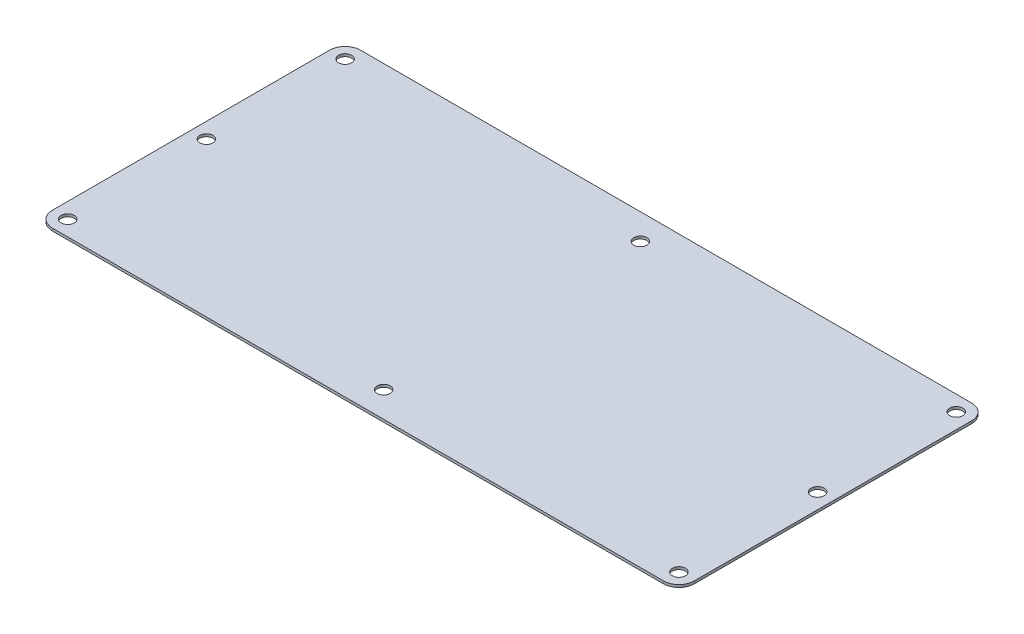
ISO-10303-21;
HEADER;
FILE_DESCRIPTION(('STEP AP214'),'2;1');
FILE_NAME('part.step','',(''),(''),'','','');
FILE_SCHEMA(('AUTOMOTIVE_DESIGN { 1 0 10303 214 1 1 1 1 }'));
ENDSEC;
DATA;
#1=APPLICATION_CONTEXT('core data for automotive mechanical design processes');
#2=APPLICATION_PROTOCOL_DEFINITION('international standard','automotive_design',2000,#1);
#3=PRODUCT_CONTEXT('',#1,'mechanical');
#4=PRODUCT('Part','Part','',(#3));
#5=PRODUCT_RELATED_PRODUCT_CATEGORY('part','',(#4));
#6=PRODUCT_DEFINITION_FORMATION('','',#4);
#7=PRODUCT_DEFINITION_CONTEXT('part definition',#1,'design');
#8=PRODUCT_DEFINITION('design','',#6,#7);
#9=PRODUCT_DEFINITION_SHAPE('','',#8);
#10=(LENGTH_UNIT() NAMED_UNIT(*) SI_UNIT(.MILLI.,.METRE.));
#11=(NAMED_UNIT(*) PLANE_ANGLE_UNIT() SI_UNIT($,.RADIAN.));
#12=(NAMED_UNIT(*) SI_UNIT($,.STERADIAN.) SOLID_ANGLE_UNIT());
#13=UNCERTAINTY_MEASURE_WITH_UNIT(LENGTH_MEASURE(1.E-05),#10,'distance_accuracy_value','');
#14=(GEOMETRIC_REPRESENTATION_CONTEXT(3) GLOBAL_UNCERTAINTY_ASSIGNED_CONTEXT((#13)) GLOBAL_UNIT_ASSIGNED_CONTEXT((#10,
#11,#12)) REPRESENTATION_CONTEXT('',''));
#15=CARTESIAN_POINT('',(0.,0.,0.));
#16=DIRECTION('',(0.,0.,1.));
#17=DIRECTION('',(1.,0.,0.));
#18=AXIS2_PLACEMENT_3D('',#15,#16,#17);
#19=CARTESIAN_POINT('',(30.3435709155538,1.,-127.137110586409));
#20=DIRECTION('',(0.,1.,0.));
#21=DIRECTION('',(0.,0.,1.));
#22=AXIS2_PLACEMENT_3D('',#19,#20,#21);
#23=PLANE('',#22);
#24=CARTESIAN_POINT('',(268.343570915553,1.,-73.1371105864091));
#25=DIRECTION('',(0.,1.,0.));
#26=DIRECTION('',(0.,0.,1.));
#27=AXIS2_PLACEMENT_3D('',#24,#25,#26);
#28=CIRCLE('',#27,2.55);
#29=CARTESIAN_POINT('',(268.343570915553,1.,-70.5871105864091));
#30=VERTEX_POINT('',#29);
#31=EDGE_CURVE('E213',#30,#30,#28,.T.);
#32=ORIENTED_EDGE('',*,*,#31,.F.);
#33=EDGE_LOOP('',(#32));
#34=FACE_BOUND('',#33,.T.);
#35=CARTESIAN_POINT('',(268.343570915554,1.,-19.1371105864091));
#36=DIRECTION('',(0.,1.,0.));
#37=DIRECTION('',(0.,0.,1.));
#38=AXIS2_PLACEMENT_3D('',#35,#36,#37);
#39=CIRCLE('',#38,2.54999999999955);
#40=CARTESIAN_POINT('',(268.343570915554,1.,-16.5871105864096));
#41=VERTEX_POINT('',#40);
#42=EDGE_CURVE('E201',#41,#41,#39,.T.);
#43=ORIENTED_EDGE('',*,*,#42,.F.);
#44=EDGE_LOOP('',(#43));
#45=FACE_BOUND('',#44,.T.);
#46=CARTESIAN_POINT('',(149.343570915554,1.,-123.137110586409));
#47=DIRECTION('',(0.,1.,0.));
#48=DIRECTION('',(0.,0.,1.));
#49=AXIS2_PLACEMENT_3D('',#46,#47,#48);
#50=CIRCLE('',#49,2.55);
#51=CARTESIAN_POINT('',(149.343570915554,1.,-120.587110586409));
#52=VERTEX_POINT('',#51);
#53=EDGE_CURVE('E189',#52,#52,#50,.T.);
#54=ORIENTED_EDGE('',*,*,#53,.F.);
#55=EDGE_LOOP('',(#54));
#56=FACE_BOUND('',#55,.T.);
#57=CARTESIAN_POINT('',(30.3435709155538,1.,-127.137110586409));
#58=DIRECTION('',(0.,1.,0.));
#59=DIRECTION('',(0.,0.,1.));
#60=AXIS2_PLACEMENT_3D('',#57,#58,#59);
#61=CIRCLE('',#60,2.55000000000045);
#62=CARTESIAN_POINT('',(30.3435709155538,1.,-124.587110586409));
#63=VERTEX_POINT('',#62);
#64=EDGE_CURVE('E135',#63,#63,#61,.T.);
#65=ORIENTED_EDGE('',*,*,#64,.F.);
#66=EDGE_LOOP('',(#65));
#67=FACE_BOUND('',#66,.T.);
#68=CARTESIAN_POINT('',(30.3435709155538,1.,-127.137110586409));
#69=DIRECTION('',(0.,1.,0.));
#70=DIRECTION('',(0.,0.,1.));
#71=AXIS2_PLACEMENT_3D('',#68,#69,#70);
#72=CIRCLE('',#71,6.);
#73=CARTESIAN_POINT('',(30.3435709155538,1.,-133.137110586409));
#74=VERTEX_POINT('',#73);
#75=CARTESIAN_POINT('',(24.3435709155538,1.,-127.137110586409));
#76=VERTEX_POINT('',#75);
#77=EDGE_CURVE('E146',#74,#76,#72,.T.);
#78=ORIENTED_EDGE('',*,*,#77,.T.);
#79=DIRECTION('',(0.,0.,1.));
#80=VECTOR('',#79,1.);
#81=CARTESIAN_POINT('',(24.3435709155538,1.,-19.1371105864091));
#82=LINE('',#81,#80);
#83=CARTESIAN_POINT('',(24.3435709155538,1.,-19.1371105864091));
#84=VERTEX_POINT('',#83);
#85=EDGE_CURVE('E94',#76,#84,#82,.T.);
#86=ORIENTED_EDGE('',*,*,#85,.T.);
#87=CARTESIAN_POINT('',(30.3435709155538,1.,-19.1371105864091));
#88=DIRECTION('',(0.,1.,0.));
#89=DIRECTION('',(0.,0.,1.));
#90=AXIS2_PLACEMENT_3D('',#87,#88,#89);
#91=CIRCLE('',#90,6.);
#92=CARTESIAN_POINT('',(30.3435709155538,1.,-13.1371105864091));
#93=VERTEX_POINT('',#92);
#94=EDGE_CURVE('E161',#84,#93,#91,.T.);
#95=ORIENTED_EDGE('',*,*,#94,.T.);
#96=DIRECTION('',(1.,0.,0.));
#97=VECTOR('',#96,1.);
#98=CARTESIAN_POINT('',(268.343570915554,1.,-13.1371105864091));
#99=LINE('',#98,#97);
#100=CARTESIAN_POINT('',(268.343570915554,1.,-13.1371105864091));
#101=VERTEX_POINT('',#100);
#102=EDGE_CURVE('E174',#93,#101,#99,.T.);
#103=ORIENTED_EDGE('',*,*,#102,.T.);
#104=CARTESIAN_POINT('',(268.343570915554,1.,-19.1371105864091));
#105=DIRECTION('',(0.,1.,0.));
#106=DIRECTION('',(0.,0.,1.));
#107=AXIS2_PLACEMENT_3D('',#104,#105,#106);
#108=CIRCLE('',#107,6.);
#109=CARTESIAN_POINT('',(274.343570915554,1.,-19.1371105864091));
#110=VERTEX_POINT('',#109);
#111=EDGE_CURVE('E113',#101,#110,#108,.T.);
#112=ORIENTED_EDGE('',*,*,#111,.T.);
#113=DIRECTION('',(0.,0.,-1.));
#114=VECTOR('',#113,1.);
#115=CARTESIAN_POINT('',(274.343570915554,1.,-127.137110586409));
#116=LINE('',#115,#114);
#117=CARTESIAN_POINT('',(274.343570915554,1.,-127.137110586409));
#118=VERTEX_POINT('',#117);
#119=EDGE_CURVE('E107',#110,#118,#116,.T.);
#120=ORIENTED_EDGE('',*,*,#119,.T.);
#121=CARTESIAN_POINT('',(268.343570915554,1.,-127.137110586409));
#122=DIRECTION('',(0.,1.,0.));
#123=DIRECTION('',(0.,0.,1.));
#124=AXIS2_PLACEMENT_3D('',#121,#122,#123);
#125=CIRCLE('',#124,6.00000000000001);
#126=CARTESIAN_POINT('',(268.343570915554,1.,-133.137110586409));
#127=VERTEX_POINT('',#126);
#128=EDGE_CURVE('E111',#118,#127,#125,.T.);
#129=ORIENTED_EDGE('',*,*,#128,.T.);
#130=DIRECTION('',(-1.,0.,0.));
#131=VECTOR('',#130,1.);
#132=CARTESIAN_POINT('',(30.3435709155538,1.,-133.137110586409));
#133=LINE('',#132,#131);
#134=EDGE_CURVE('E51',#127,#74,#133,.T.);
#135=ORIENTED_EDGE('',*,*,#134,.T.);
#136=EDGE_LOOP('',(#78,#86,#95,#103,#112,#120,#129,#135));
#137=FACE_BOUND('',#136,.T.);
#138=CARTESIAN_POINT('',(268.343570915554,1.,-127.137110586409));
#139=DIRECTION('',(0.,1.,0.));
#140=DIRECTION('',(0.,0.,1.));
#141=AXIS2_PLACEMENT_3D('',#138,#139,#140);
#142=CIRCLE('',#141,2.54999999999955);
#143=CARTESIAN_POINT('',(268.343570915554,1.,-124.58711058641));
#144=VERTEX_POINT('',#143);
#145=EDGE_CURVE('E183',#144,#144,#142,.T.);
#146=ORIENTED_EDGE('',*,*,#145,.F.);
#147=EDGE_LOOP('',(#146));
#148=FACE_BOUND('',#147,.T.);
#149=CARTESIAN_POINT('',(30.3435709155538,1.,-19.1371105864091));
#150=DIRECTION('',(0.,1.,0.));
#151=DIRECTION('',(0.,0.,1.));
#152=AXIS2_PLACEMENT_3D('',#149,#150,#151);
#153=CIRCLE('',#152,2.55000000000045);
#154=CARTESIAN_POINT('',(30.3435709155538,1.,-16.5871105864087));
#155=VERTEX_POINT('',#154);
#156=EDGE_CURVE('E195',#155,#155,#153,.T.);
#157=ORIENTED_EDGE('',*,*,#156,.F.);
#158=EDGE_LOOP('',(#157));
#159=FACE_BOUND('',#158,.T.);
#160=CARTESIAN_POINT('',(149.343570915554,1.,-23.1371105864091));
#161=DIRECTION('',(0.,1.,0.));
#162=DIRECTION('',(0.,0.,1.));
#163=AXIS2_PLACEMENT_3D('',#160,#161,#162);
#164=CIRCLE('',#163,2.55);
#165=CARTESIAN_POINT('',(149.343570915554,1.,-20.5871105864091));
#166=VERTEX_POINT('',#165);
#167=EDGE_CURVE('E207',#166,#166,#164,.T.);
#168=ORIENTED_EDGE('',*,*,#167,.F.);
#169=EDGE_LOOP('',(#168));
#170=FACE_BOUND('',#169,.T.);
#171=CARTESIAN_POINT('',(30.3435709155542,1.,-73.1371105864091));
#172=DIRECTION('',(0.,1.,0.));
#173=DIRECTION('',(0.,0.,1.));
#174=AXIS2_PLACEMENT_3D('',#171,#172,#173);
#175=CIRCLE('',#174,2.55);
#176=CARTESIAN_POINT('',(30.3435709155542,1.,-70.5871105864091));
#177=VERTEX_POINT('',#176);
#178=EDGE_CURVE('E219',#177,#177,#175,.T.);
#179=ORIENTED_EDGE('',*,*,#178,.F.);
#180=EDGE_LOOP('',(#179));
#181=FACE_BOUND('',#180,.T.);
#182=ADVANCED_FACE('F34',(#34,#45,#56,#67,#137,#148,#159,#170,#181),#23,.T.);
#183=CARTESIAN_POINT('',(30.3435709155538,0.,-127.137110586409));
#184=DIRECTION('',(0.,1.,0.));
#185=DIRECTION('',(0.,0.,1.));
#186=AXIS2_PLACEMENT_3D('',#183,#184,#185);
#187=PLANE('',#186);
#188=CARTESIAN_POINT('',(30.3435709155538,0.,-127.137110586409));
#189=DIRECTION('',(0.,1.,0.));
#190=DIRECTION('',(0.,0.,1.));
#191=AXIS2_PLACEMENT_3D('',#188,#189,#190);
#192=CIRCLE('',#191,6.);
#193=CARTESIAN_POINT('',(30.3435709155538,0.,-133.137110586409));
#194=VERTEX_POINT('',#193);
#195=CARTESIAN_POINT('',(24.3435709155538,0.,-127.137110586409));
#196=VERTEX_POINT('',#195);
#197=EDGE_CURVE('E131',#194,#196,#192,.T.);
#198=ORIENTED_EDGE('',*,*,#197,.F.);
#199=DIRECTION('',(-1.,0.,0.));
#200=VECTOR('',#199,1.);
#201=CARTESIAN_POINT('',(30.3435709155538,0.,-133.137110586409));
#202=LINE('',#201,#200);
#203=CARTESIAN_POINT('',(268.343570915554,0.,-133.137110586409));
#204=VERTEX_POINT('',#203);
#205=EDGE_CURVE('E86',#204,#194,#202,.T.);
#206=ORIENTED_EDGE('',*,*,#205,.F.);
#207=CARTESIAN_POINT('',(268.343570915554,0.,-127.137110586409));
#208=DIRECTION('',(0.,1.,0.));
#209=DIRECTION('',(0.,0.,1.));
#210=AXIS2_PLACEMENT_3D('',#207,#208,#209);
#211=CIRCLE('',#210,6.00000000000001);
#212=CARTESIAN_POINT('',(274.343570915554,0.,-127.137110586409));
#213=VERTEX_POINT('',#212);
#214=EDGE_CURVE('E80',#213,#204,#211,.T.);
#215=ORIENTED_EDGE('',*,*,#214,.F.);
#216=DIRECTION('',(0.,0.,-1.));
#217=VECTOR('',#216,1.);
#218=CARTESIAN_POINT('',(274.343570915554,0.,-127.137110586409));
#219=LINE('',#218,#217);
#220=CARTESIAN_POINT('',(274.343570915554,0.,-19.1371105864091));
#221=VERTEX_POINT('',#220);
#222=EDGE_CURVE('E121',#221,#213,#219,.T.);
#223=ORIENTED_EDGE('',*,*,#222,.F.);
#224=CARTESIAN_POINT('',(268.343570915554,0.,-19.1371105864091));
#225=DIRECTION('',(0.,1.,0.));
#226=DIRECTION('',(0.,0.,1.));
#227=AXIS2_PLACEMENT_3D('',#224,#225,#226);
#228=CIRCLE('',#227,6.);
#229=CARTESIAN_POINT('',(268.343570915554,0.,-13.1371105864091));
#230=VERTEX_POINT('',#229);
#231=EDGE_CURVE('E141',#230,#221,#228,.T.);
#232=ORIENTED_EDGE('',*,*,#231,.F.);
#233=DIRECTION('',(1.,0.,0.));
#234=VECTOR('',#233,1.);
#235=CARTESIAN_POINT('',(268.343570915554,0.,-13.1371105864091));
#236=LINE('',#235,#234);
#237=CARTESIAN_POINT('',(30.3435709155538,0.,-13.1371105864091));
#238=VERTEX_POINT('',#237);
#239=EDGE_CURVE('E139',#238,#230,#236,.T.);
#240=ORIENTED_EDGE('',*,*,#239,.F.);
#241=CARTESIAN_POINT('',(30.3435709155538,0.,-19.1371105864091));
#242=DIRECTION('',(0.,1.,0.));
#243=DIRECTION('',(0.,0.,1.));
#244=AXIS2_PLACEMENT_3D('',#241,#242,#243);
#245=CIRCLE('',#244,6.);
#246=CARTESIAN_POINT('',(24.3435709155538,0.,-19.1371105864091));
#247=VERTEX_POINT('',#246);
#248=EDGE_CURVE('E137',#247,#238,#245,.T.);
#249=ORIENTED_EDGE('',*,*,#248,.F.);
#250=DIRECTION('',(0.,0.,1.));
#251=VECTOR('',#250,1.);
#252=CARTESIAN_POINT('',(24.3435709155538,0.,-19.1371105864091));
#253=LINE('',#252,#251);
#254=EDGE_CURVE('E134',#196,#247,#253,.T.);
#255=ORIENTED_EDGE('',*,*,#254,.F.);
#256=EDGE_LOOP('',(#198,#206,#215,#223,#232,#240,#249,#255));
#257=FACE_BOUND('',#256,.T.);
#258=CARTESIAN_POINT('',(30.3435709155538,0.,-127.137110586409));
#259=DIRECTION('',(0.,1.,0.));
#260=DIRECTION('',(0.,0.,1.));
#261=AXIS2_PLACEMENT_3D('',#258,#259,#260);
#262=CIRCLE('',#261,2.55000000000045);
#263=CARTESIAN_POINT('',(30.3435709155538,0.,-124.587110586409));
#264=VERTEX_POINT('',#263);
#265=EDGE_CURVE('E180',#264,#264,#262,.T.);
#266=ORIENTED_EDGE('',*,*,#265,.T.);
#267=EDGE_LOOP('',(#266));
#268=FACE_BOUND('',#267,.T.);
#269=CARTESIAN_POINT('',(268.343570915554,0.,-127.137110586409));
#270=DIRECTION('',(0.,1.,0.));
#271=DIRECTION('',(0.,0.,1.));
#272=AXIS2_PLACEMENT_3D('',#269,#270,#271);
#273=CIRCLE('',#272,2.54999999999955);
#274=CARTESIAN_POINT('',(268.343570915554,0.,-124.58711058641));
#275=VERTEX_POINT('',#274);
#276=EDGE_CURVE('E186',#275,#275,#273,.T.);
#277=ORIENTED_EDGE('',*,*,#276,.T.);
#278=EDGE_LOOP('',(#277));
#279=FACE_BOUND('',#278,.T.);
#280=CARTESIAN_POINT('',(149.343570915554,0.,-123.137110586409));
#281=DIRECTION('',(0.,1.,0.));
#282=DIRECTION('',(0.,0.,1.));
#283=AXIS2_PLACEMENT_3D('',#280,#281,#282);
#284=CIRCLE('',#283,2.55);
#285=CARTESIAN_POINT('',(149.343570915554,0.,-120.587110586409));
#286=VERTEX_POINT('',#285);
#287=EDGE_CURVE('E192',#286,#286,#284,.T.);
#288=ORIENTED_EDGE('',*,*,#287,.T.);
#289=EDGE_LOOP('',(#288));
#290=FACE_BOUND('',#289,.T.);
#291=CARTESIAN_POINT('',(30.3435709155538,0.,-19.1371105864091));
#292=DIRECTION('',(0.,1.,0.));
#293=DIRECTION('',(0.,0.,1.));
#294=AXIS2_PLACEMENT_3D('',#291,#292,#293);
#295=CIRCLE('',#294,2.55000000000045);
#296=CARTESIAN_POINT('',(30.3435709155538,0.,-16.5871105864087));
#297=VERTEX_POINT('',#296);
#298=EDGE_CURVE('E198',#297,#297,#295,.T.);
#299=ORIENTED_EDGE('',*,*,#298,.T.);
#300=EDGE_LOOP('',(#299));
#301=FACE_BOUND('',#300,.T.);
#302=CARTESIAN_POINT('',(268.343570915554,0.,-19.1371105864091));
#303=DIRECTION('',(0.,1.,0.));
#304=DIRECTION('',(0.,0.,1.));
#305=AXIS2_PLACEMENT_3D('',#302,#303,#304);
#306=CIRCLE('',#305,2.54999999999955);
#307=CARTESIAN_POINT('',(268.343570915554,0.,-16.5871105864096));
#308=VERTEX_POINT('',#307);
#309=EDGE_CURVE('E204',#308,#308,#306,.T.);
#310=ORIENTED_EDGE('',*,*,#309,.T.);
#311=EDGE_LOOP('',(#310));
#312=FACE_BOUND('',#311,.T.);
#313=CARTESIAN_POINT('',(149.343570915554,0.,-23.1371105864091));
#314=DIRECTION('',(0.,1.,0.));
#315=DIRECTION('',(0.,0.,1.));
#316=AXIS2_PLACEMENT_3D('',#313,#314,#315);
#317=CIRCLE('',#316,2.55);
#318=CARTESIAN_POINT('',(149.343570915554,0.,-20.5871105864091));
#319=VERTEX_POINT('',#318);
#320=EDGE_CURVE('E210',#319,#319,#317,.T.);
#321=ORIENTED_EDGE('',*,*,#320,.T.);
#322=EDGE_LOOP('',(#321));
#323=FACE_BOUND('',#322,.T.);
#324=CARTESIAN_POINT('',(268.343570915553,0.,-73.1371105864091));
#325=DIRECTION('',(0.,1.,0.));
#326=DIRECTION('',(0.,0.,1.));
#327=AXIS2_PLACEMENT_3D('',#324,#325,#326);
#328=CIRCLE('',#327,2.55);
#329=CARTESIAN_POINT('',(268.343570915553,0.,-70.5871105864091));
#330=VERTEX_POINT('',#329);
#331=EDGE_CURVE('E216',#330,#330,#328,.T.);
#332=ORIENTED_EDGE('',*,*,#331,.T.);
#333=EDGE_LOOP('',(#332));
#334=FACE_BOUND('',#333,.T.);
#335=CARTESIAN_POINT('',(30.3435709155542,0.,-73.1371105864091));
#336=DIRECTION('',(0.,1.,0.));
#337=DIRECTION('',(0.,0.,1.));
#338=AXIS2_PLACEMENT_3D('',#335,#336,#337);
#339=CIRCLE('',#338,2.55);
#340=CARTESIAN_POINT('',(30.3435709155542,0.,-70.5871105864091));
#341=VERTEX_POINT('',#340);
#342=EDGE_CURVE('E222',#341,#341,#339,.T.);
#343=ORIENTED_EDGE('',*,*,#342,.T.);
#344=EDGE_LOOP('',(#343));
#345=FACE_BOUND('',#344,.T.);
#346=ADVANCED_FACE('F165',(#257,#268,#279,#290,#301,#312,#323,#334,#345),#187,.F.);
#347=CARTESIAN_POINT('',(30.3435709155538,1.,-127.137110586409));
#348=DIRECTION('',(0.,-1.,0.));
#349=DIRECTION('',(0.,0.,-1.));
#350=AXIS2_PLACEMENT_3D('',#347,#348,#349);
#351=CYLINDRICAL_SURFACE('',#350,6.);
#352=ORIENTED_EDGE('',*,*,#197,.T.);
#353=DIRECTION('',(0.,-1.,0.));
#354=VECTOR('',#353,1.);
#355=CARTESIAN_POINT('',(24.3435709155538,1.,-127.137110586409));
#356=LINE('',#355,#354);
#357=EDGE_CURVE('E11',#76,#196,#356,.T.);
#358=ORIENTED_EDGE('',*,*,#357,.F.);
#359=ORIENTED_EDGE('',*,*,#77,.F.);
#360=DIRECTION('',(0.,-1.,0.));
#361=VECTOR('',#360,1.);
#362=CARTESIAN_POINT('',(30.3435709155538,1.,-133.137110586409));
#363=LINE('',#362,#361);
#364=EDGE_CURVE('E127',#74,#194,#363,.T.);
#365=ORIENTED_EDGE('',*,*,#364,.T.);
#366=EDGE_LOOP('',(#352,#358,#359,#365));
#367=FACE_BOUND('',#366,.T.);
#368=ADVANCED_FACE('F36',(#367),#351,.T.);
#369=CARTESIAN_POINT('',(24.3435709155538,1.,-19.1371105864091));
#370=DIRECTION('',(1.,0.,0.));
#371=DIRECTION('',(0.,0.,-1.));
#372=AXIS2_PLACEMENT_3D('',#369,#370,#371);
#373=PLANE('',#372);
#374=ORIENTED_EDGE('',*,*,#254,.T.);
#375=DIRECTION('',(0.,-1.,0.));
#376=VECTOR('',#375,1.);
#377=CARTESIAN_POINT('',(24.3435709155538,1.,-19.1371105864091));
#378=LINE('',#377,#376);
#379=EDGE_CURVE('E43',#84,#247,#378,.T.);
#380=ORIENTED_EDGE('',*,*,#379,.F.);
#381=ORIENTED_EDGE('',*,*,#85,.F.);
#382=ORIENTED_EDGE('',*,*,#357,.T.);
#383=EDGE_LOOP('',(#374,#380,#381,#382));
#384=FACE_BOUND('',#383,.T.);
#385=ADVANCED_FACE('F256',(#384),#373,.F.);
#386=CARTESIAN_POINT('',(30.3435709155538,1.,-19.1371105864091));
#387=DIRECTION('',(0.,-1.,0.));
#388=DIRECTION('',(0.,0.,-1.));
#389=AXIS2_PLACEMENT_3D('',#386,#387,#388);
#390=CYLINDRICAL_SURFACE('',#389,6.);
#391=ORIENTED_EDGE('',*,*,#248,.T.);
#392=DIRECTION('',(0.,-1.,0.));
#393=VECTOR('',#392,1.);
#394=CARTESIAN_POINT('',(30.3435709155538,1.,-13.1371105864091));
#395=LINE('',#394,#393);
#396=EDGE_CURVE('E153',#93,#238,#395,.T.);
#397=ORIENTED_EDGE('',*,*,#396,.F.);
#398=ORIENTED_EDGE('',*,*,#94,.F.);
#399=ORIENTED_EDGE('',*,*,#379,.T.);
#400=EDGE_LOOP('',(#391,#397,#398,#399));
#401=FACE_BOUND('',#400,.T.);
#402=ADVANCED_FACE('F159',(#401),#390,.T.);
#403=CARTESIAN_POINT('',(268.343570915554,1.,-13.1371105864091));
#404=DIRECTION('',(0.,0.,-1.));
#405=DIRECTION('',(-1.,0.,0.));
#406=AXIS2_PLACEMENT_3D('',#403,#404,#405);
#407=PLANE('',#406);
#408=ORIENTED_EDGE('',*,*,#239,.T.);
#409=DIRECTION('',(0.,-1.,0.));
#410=VECTOR('',#409,1.);
#411=CARTESIAN_POINT('',(268.343570915554,1.,-13.1371105864091));
#412=LINE('',#411,#410);
#413=EDGE_CURVE('E150',#101,#230,#412,.T.);
#414=ORIENTED_EDGE('',*,*,#413,.F.);
#415=ORIENTED_EDGE('',*,*,#102,.F.);
#416=ORIENTED_EDGE('',*,*,#396,.T.);
#417=EDGE_LOOP('',(#408,#414,#415,#416));
#418=FACE_BOUND('',#417,.T.);
#419=ADVANCED_FACE('F170',(#418),#407,.F.);
#420=CARTESIAN_POINT('',(268.343570915554,1.,-19.1371105864091));
#421=DIRECTION('',(0.,-1.,0.));
#422=DIRECTION('',(0.,0.,-1.));
#423=AXIS2_PLACEMENT_3D('',#420,#421,#422);
#424=CYLINDRICAL_SURFACE('',#423,6.);
#425=ORIENTED_EDGE('',*,*,#231,.T.);
#426=DIRECTION('',(0.,-1.,0.));
#427=VECTOR('',#426,1.);
#428=CARTESIAN_POINT('',(274.343570915554,1.,-19.1371105864091));
#429=LINE('',#428,#427);
#430=EDGE_CURVE('E122',#110,#221,#429,.T.);
#431=ORIENTED_EDGE('',*,*,#430,.F.);
#432=ORIENTED_EDGE('',*,*,#111,.F.);
#433=ORIENTED_EDGE('',*,*,#413,.T.);
#434=EDGE_LOOP('',(#425,#431,#432,#433));
#435=FACE_BOUND('',#434,.T.);
#436=ADVANCED_FACE('F173',(#435),#424,.T.);
#437=CARTESIAN_POINT('',(274.343570915554,1.,-127.137110586409));
#438=DIRECTION('',(-1.,0.,0.));
#439=DIRECTION('',(0.,0.,1.));
#440=AXIS2_PLACEMENT_3D('',#437,#438,#439);
#441=PLANE('',#440);
#442=ORIENTED_EDGE('',*,*,#222,.T.);
#443=DIRECTION('',(0.,-1.,0.));
#444=VECTOR('',#443,1.);
#445=CARTESIAN_POINT('',(274.343570915554,1.,-127.137110586409));
#446=LINE('',#445,#444);
#447=EDGE_CURVE('E118',#118,#213,#446,.T.);
#448=ORIENTED_EDGE('',*,*,#447,.F.);
#449=ORIENTED_EDGE('',*,*,#119,.F.);
#450=ORIENTED_EDGE('',*,*,#430,.T.);
#451=EDGE_LOOP('',(#442,#448,#449,#450));
#452=FACE_BOUND('',#451,.T.);
#453=ADVANCED_FACE('F119',(#452),#441,.F.);
#454=CARTESIAN_POINT('',(268.343570915554,1.,-127.137110586409));
#455=DIRECTION('',(0.,-1.,0.));
#456=DIRECTION('',(0.,0.,-1.));
#457=AXIS2_PLACEMENT_3D('',#454,#455,#456);
#458=CYLINDRICAL_SURFACE('',#457,6.00000000000001);
#459=ORIENTED_EDGE('',*,*,#214,.T.);
#460=DIRECTION('',(0.,-1.,0.));
#461=VECTOR('',#460,1.);
#462=CARTESIAN_POINT('',(268.343570915554,1.,-133.137110586409));
#463=LINE('',#462,#461);
#464=EDGE_CURVE('E123',#127,#204,#463,.T.);
#465=ORIENTED_EDGE('',*,*,#464,.F.);
#466=ORIENTED_EDGE('',*,*,#128,.F.);
#467=ORIENTED_EDGE('',*,*,#447,.T.);
#468=EDGE_LOOP('',(#459,#465,#466,#467));
#469=FACE_BOUND('',#468,.T.);
#470=ADVANCED_FACE('F125',(#469),#458,.T.);
#471=CARTESIAN_POINT('',(30.3435709155538,1.,-133.137110586409));
#472=DIRECTION('',(0.,0.,1.));
#473=DIRECTION('',(1.,0.,0.));
#474=AXIS2_PLACEMENT_3D('',#471,#472,#473);
#475=PLANE('',#474);
#476=ORIENTED_EDGE('',*,*,#205,.T.);
#477=ORIENTED_EDGE('',*,*,#364,.F.);
#478=ORIENTED_EDGE('',*,*,#134,.F.);
#479=ORIENTED_EDGE('',*,*,#464,.T.);
#480=EDGE_LOOP('',(#476,#477,#478,#479));
#481=FACE_BOUND('',#480,.T.);
#482=ADVANCED_FACE('F244',(#481),#475,.F.);
#483=CARTESIAN_POINT('',(30.3435709155538,1.,-127.137110586409));
#484=DIRECTION('',(0.,-1.,0.));
#485=DIRECTION('',(0.,0.,-1.));
#486=AXIS2_PLACEMENT_3D('',#483,#484,#485);
#487=CYLINDRICAL_SURFACE('',#486,2.55000000000045);
#488=ORIENTED_EDGE('',*,*,#64,.T.);
#489=EDGE_LOOP('',(#488));
#490=FACE_BOUND('',#489,.T.);
#491=ORIENTED_EDGE('',*,*,#265,.F.);
#492=EDGE_LOOP('',(#491));
#493=FACE_BOUND('',#492,.T.);
#494=ADVANCED_FACE('F241',(#490,#493),#487,.F.);
#495=CARTESIAN_POINT('',(268.343570915554,1.,-127.137110586409));
#496=DIRECTION('',(0.,-1.,0.));
#497=DIRECTION('',(0.,0.,-1.));
#498=AXIS2_PLACEMENT_3D('',#495,#496,#497);
#499=CYLINDRICAL_SURFACE('',#498,2.54999999999955);
#500=ORIENTED_EDGE('',*,*,#145,.T.);
#501=EDGE_LOOP('',(#500));
#502=FACE_BOUND('',#501,.T.);
#503=ORIENTED_EDGE('',*,*,#276,.F.);
#504=EDGE_LOOP('',(#503));
#505=FACE_BOUND('',#504,.T.);
#506=ADVANCED_FACE('F320',(#502,#505),#499,.F.);
#507=CARTESIAN_POINT('',(149.343570915554,1.,-123.137110586409));
#508=DIRECTION('',(0.,-1.,0.));
#509=DIRECTION('',(0.,0.,-1.));
#510=AXIS2_PLACEMENT_3D('',#507,#508,#509);
#511=CYLINDRICAL_SURFACE('',#510,2.55);
#512=ORIENTED_EDGE('',*,*,#53,.T.);
#513=EDGE_LOOP('',(#512));
#514=FACE_BOUND('',#513,.T.);
#515=ORIENTED_EDGE('',*,*,#287,.F.);
#516=EDGE_LOOP('',(#515));
#517=FACE_BOUND('',#516,.T.);
#518=ADVANCED_FACE('F328',(#514,#517),#511,.F.);
#519=CARTESIAN_POINT('',(30.3435709155538,1.,-19.1371105864091));
#520=DIRECTION('',(0.,-1.,0.));
#521=DIRECTION('',(0.,0.,-1.));
#522=AXIS2_PLACEMENT_3D('',#519,#520,#521);
#523=CYLINDRICAL_SURFACE('',#522,2.55000000000045);
#524=ORIENTED_EDGE('',*,*,#156,.T.);
#525=EDGE_LOOP('',(#524));
#526=FACE_BOUND('',#525,.T.);
#527=ORIENTED_EDGE('',*,*,#298,.F.);
#528=EDGE_LOOP('',(#527));
#529=FACE_BOUND('',#528,.T.);
#530=ADVANCED_FACE('F336',(#526,#529),#523,.F.);
#531=CARTESIAN_POINT('',(268.343570915554,1.,-19.1371105864091));
#532=DIRECTION('',(0.,-1.,0.));
#533=DIRECTION('',(0.,0.,-1.));
#534=AXIS2_PLACEMENT_3D('',#531,#532,#533);
#535=CYLINDRICAL_SURFACE('',#534,2.54999999999955);
#536=ORIENTED_EDGE('',*,*,#42,.T.);
#537=EDGE_LOOP('',(#536));
#538=FACE_BOUND('',#537,.T.);
#539=ORIENTED_EDGE('',*,*,#309,.F.);
#540=EDGE_LOOP('',(#539));
#541=FACE_BOUND('',#540,.T.);
#542=ADVANCED_FACE('F345',(#538,#541),#535,.F.);
#543=CARTESIAN_POINT('',(149.343570915554,1.,-23.1371105864091));
#544=DIRECTION('',(0.,-1.,0.));
#545=DIRECTION('',(0.,0.,-1.));
#546=AXIS2_PLACEMENT_3D('',#543,#544,#545);
#547=CYLINDRICAL_SURFACE('',#546,2.55);
#548=ORIENTED_EDGE('',*,*,#167,.T.);
#549=EDGE_LOOP('',(#548));
#550=FACE_BOUND('',#549,.T.);
#551=ORIENTED_EDGE('',*,*,#320,.F.);
#552=EDGE_LOOP('',(#551));
#553=FACE_BOUND('',#552,.T.);
#554=ADVANCED_FACE('F354',(#550,#553),#547,.F.);
#555=CARTESIAN_POINT('',(268.343570915553,1.,-73.1371105864091));
#556=DIRECTION('',(0.,-1.,0.));
#557=DIRECTION('',(0.,0.,-1.));
#558=AXIS2_PLACEMENT_3D('',#555,#556,#557);
#559=CYLINDRICAL_SURFACE('',#558,2.55);
#560=ORIENTED_EDGE('',*,*,#31,.T.);
#561=EDGE_LOOP('',(#560));
#562=FACE_BOUND('',#561,.T.);
#563=ORIENTED_EDGE('',*,*,#331,.F.);
#564=EDGE_LOOP('',(#563));
#565=FACE_BOUND('',#564,.T.);
#566=ADVANCED_FACE('F363',(#562,#565),#559,.F.);
#567=CARTESIAN_POINT('',(30.3435709155542,1.,-73.1371105864091));
#568=DIRECTION('',(0.,-1.,0.));
#569=DIRECTION('',(0.,0.,-1.));
#570=AXIS2_PLACEMENT_3D('',#567,#568,#569);
#571=CYLINDRICAL_SURFACE('',#570,2.55);
#572=ORIENTED_EDGE('',*,*,#178,.T.);
#573=EDGE_LOOP('',(#572));
#574=FACE_BOUND('',#573,.T.);
#575=ORIENTED_EDGE('',*,*,#342,.F.);
#576=EDGE_LOOP('',(#575));
#577=FACE_BOUND('',#576,.T.);
#578=ADVANCED_FACE('F228',(#574,#577),#571,.F.);
#579=CLOSED_SHELL('',(#182,#346,#368,#385,#402,#419,#436,#453,#470,#482,#494,#506,#518,#530,
#542,#554,#566,#578));
#580=MANIFOLD_SOLID_BREP('B2',#579);
#581=ADVANCED_BREP_SHAPE_REPRESENTATION('',(#18,#580),#14);
#582=SHAPE_DEFINITION_REPRESENTATION(#9,#581);
ENDSEC;
END-ISO-10303-21;
